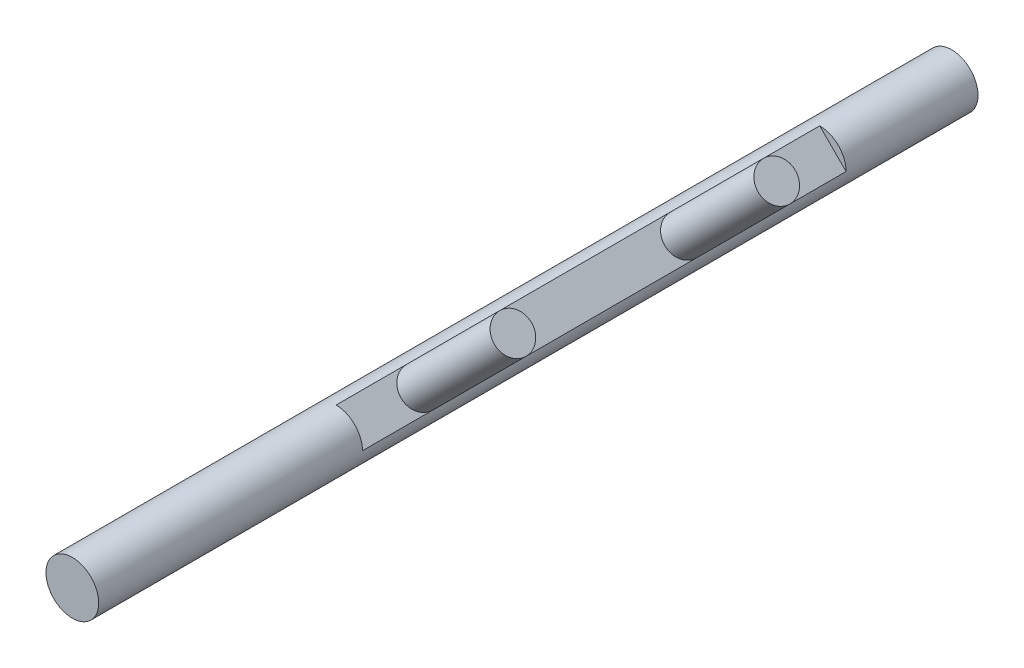
ISO-10303-21;
HEADER;
FILE_DESCRIPTION(('STEP AP214'),'2;1');
FILE_NAME('part.step','',(''),(''),'','','');
FILE_SCHEMA(('AUTOMOTIVE_DESIGN { 1 0 10303 214 1 1 1 1 }'));
ENDSEC;
DATA;
#1=APPLICATION_CONTEXT('core data for automotive mechanical design processes');
#2=APPLICATION_PROTOCOL_DEFINITION('international standard','automotive_design',2000,#1);
#3=PRODUCT_CONTEXT('',#1,'mechanical');
#4=PRODUCT('Part','Part','',(#3));
#5=PRODUCT_RELATED_PRODUCT_CATEGORY('part','',(#4));
#6=PRODUCT_DEFINITION_FORMATION('','',#4);
#7=PRODUCT_DEFINITION_CONTEXT('part definition',#1,'design');
#8=PRODUCT_DEFINITION('design','',#6,#7);
#9=PRODUCT_DEFINITION_SHAPE('','',#8);
#10=(LENGTH_UNIT() NAMED_UNIT(*) SI_UNIT(.MILLI.,.METRE.));
#11=(NAMED_UNIT(*) PLANE_ANGLE_UNIT() SI_UNIT($,.RADIAN.));
#12=(NAMED_UNIT(*) SI_UNIT($,.STERADIAN.) SOLID_ANGLE_UNIT());
#13=UNCERTAINTY_MEASURE_WITH_UNIT(LENGTH_MEASURE(1.E-05),#10,'distance_accuracy_value','');
#14=(GEOMETRIC_REPRESENTATION_CONTEXT(3) GLOBAL_UNCERTAINTY_ASSIGNED_CONTEXT((#13)) GLOBAL_UNIT_ASSIGNED_CONTEXT((#10,
#11,#12)) REPRESENTATION_CONTEXT('',''));
#15=CARTESIAN_POINT('',(0.,0.,0.));
#16=DIRECTION('',(0.,0.,1.));
#17=DIRECTION('',(1.,0.,0.));
#18=AXIS2_PLACEMENT_3D('',#15,#16,#17);
#19=CARTESIAN_POINT('',(0.,3.,70.));
#20=DIRECTION('',(-0.707106781186548,-0.707106781186548,0.));
#21=DIRECTION('',(0.707106781186548,-0.707106781186548,0.));
#22=AXIS2_PLACEMENT_3D('',#19,#20,#21);
#23=PLANE('',#22);
#24=CARTESIAN_POINT('',(1.5,1.5,62.));
#25=DIRECTION('',(0.707106781186548,0.707106781186547,0.));
#26=DIRECTION('',(-0.707106781186547,0.707106781186548,0.));
#27=AXIS2_PLACEMENT_3D('',#24,#25,#26);
#28=CIRCLE('',#27,2.12132034355965);
#29=CARTESIAN_POINT('',(3.,0.,62.));
#30=VERTEX_POINT('',#29);
#31=CARTESIAN_POINT('',(0.,3.,62.));
#32=VERTEX_POINT('',#31);
#33=EDGE_CURVE('E104',#30,#32,#28,.T.);
#34=ORIENTED_EDGE('',*,*,#33,.F.);
#35=DIRECTION('',(0.,0.,-1.));
#36=VECTOR('',#35,1.);
#37=CARTESIAN_POINT('',(3.,0.,70.));
#38=LINE('',#37,#36);
#39=CARTESIAN_POINT('',(3.,0.,32.));
#40=VERTEX_POINT('',#39);
#41=EDGE_CURVE('E131',#30,#40,#38,.T.);
#42=ORIENTED_EDGE('',*,*,#41,.T.);
#43=CARTESIAN_POINT('',(1.5,1.5,32.));
#44=DIRECTION('',(0.707106781186548,0.707106781186547,0.));
#45=DIRECTION('',(-0.707106781186547,0.707106781186548,0.));
#46=AXIS2_PLACEMENT_3D('',#43,#44,#45);
#47=CIRCLE('',#46,2.12132034355964);
#48=CARTESIAN_POINT('',(0.,3.,32.));
#49=VERTEX_POINT('',#48);
#50=EDGE_CURVE('E103',#49,#40,#47,.T.);
#51=ORIENTED_EDGE('',*,*,#50,.F.);
#52=DIRECTION('',(0.,0.,-1.));
#53=VECTOR('',#52,1.);
#54=CARTESIAN_POINT('',(0.,3.,70.));
#55=LINE('',#54,#53);
#56=EDGE_CURVE('E60',#32,#49,#55,.T.);
#57=ORIENTED_EDGE('',*,*,#56,.F.);
#58=EDGE_LOOP('',(#34,#42,#51,#57));
#59=FACE_BOUND('',#58,.T.);
#60=ADVANCED_FACE('F35',(#59),#23,.F.);
#61=EDGE_CURVE('E53',#32,#30,#28,.T.);
#62=ORIENTED_EDGE('',*,*,#61,.F.);
#63=CARTESIAN_POINT('',(0.,3.,70.));
#64=VERTEX_POINT('',#63);
#65=EDGE_CURVE('E76',#64,#32,#55,.T.);
#66=ORIENTED_EDGE('',*,*,#65,.F.);
#67=DIRECTION('',(-0.707106781186548,0.707106781186548,0.));
#68=VECTOR('',#67,1.);
#69=CARTESIAN_POINT('',(0.,3.,70.));
#70=LINE('',#69,#68);
#71=CARTESIAN_POINT('',(3.,0.,70.));
#72=VERTEX_POINT('',#71);
#73=EDGE_CURVE('E39',#72,#64,#70,.T.);
#74=ORIENTED_EDGE('',*,*,#73,.F.);
#75=EDGE_CURVE('E93',#72,#30,#38,.T.);
#76=ORIENTED_EDGE('',*,*,#75,.T.);
#77=EDGE_LOOP('',(#62,#66,#74,#76));
#78=FACE_BOUND('',#77,.T.);
#79=ADVANCED_FACE('F78',(#78),#23,.F.);
#80=CARTESIAN_POINT('',(1.5,1.5,32.));
#81=DIRECTION('',(-0.707106781186548,-0.707106781186548,0.));
#82=DIRECTION('',(0.707106781186548,-0.707106781186548,0.));
#83=AXIS2_PLACEMENT_3D('',#80,#81,#82);
#84=CIRCLE('',#83,2.12132034355964);
#85=EDGE_CURVE('E11',#40,#49,#84,.F.);
#86=ORIENTED_EDGE('',*,*,#85,.F.);
#87=CARTESIAN_POINT('',(3.,0.,15.));
#88=VERTEX_POINT('',#87);
#89=EDGE_CURVE('E82',#40,#88,#38,.T.);
#90=ORIENTED_EDGE('',*,*,#89,.T.);
#91=DIRECTION('',(-0.707106781186548,0.707106781186548,0.));
#92=VECTOR('',#91,1.);
#93=CARTESIAN_POINT('',(0.,3.,15.));
#94=LINE('',#93,#92);
#95=CARTESIAN_POINT('',(0.,3.,15.));
#96=VERTEX_POINT('',#95);
#97=EDGE_CURVE('E89',#88,#96,#94,.T.);
#98=ORIENTED_EDGE('',*,*,#97,.T.);
#99=EDGE_CURVE('E88',#49,#96,#55,.T.);
#100=ORIENTED_EDGE('',*,*,#99,.F.);
#101=EDGE_LOOP('',(#86,#90,#98,#100));
#102=FACE_BOUND('',#101,.T.);
#103=ADVANCED_FACE('F151',(#102),#23,.F.);
#104=CARTESIAN_POINT('',(0.,0.,15.));
#105=DIRECTION('',(0.,0.,-1.));
#106=DIRECTION('',(-1.,0.,0.));
#107=AXIS2_PLACEMENT_3D('',#104,#105,#106);
#108=CYLINDRICAL_SURFACE('',#107,3.);
#109=CARTESIAN_POINT('',(0.,0.,15.));
#110=DIRECTION('',(0.,0.,1.));
#111=DIRECTION('',(1.,0.,0.));
#112=AXIS2_PLACEMENT_3D('',#109,#110,#111);
#113=CIRCLE('',#112,3.);
#114=EDGE_CURVE('E45',#88,#96,#113,.T.);
#115=ORIENTED_EDGE('',*,*,#114,.F.);
#116=ORIENTED_EDGE('',*,*,#89,.F.);
#117=ORIENTED_EDGE('',*,*,#41,.F.);
#118=ORIENTED_EDGE('',*,*,#75,.F.);
#119=CARTESIAN_POINT('',(0.,0.,70.));
#120=DIRECTION('',(0.,0.,1.));
#121=DIRECTION('',(1.,0.,0.));
#122=AXIS2_PLACEMENT_3D('',#119,#120,#121);
#123=CIRCLE('',#122,3.);
#124=EDGE_CURVE('E87',#72,#64,#123,.T.);
#125=ORIENTED_EDGE('',*,*,#124,.T.);
#126=ORIENTED_EDGE('',*,*,#65,.T.);
#127=ORIENTED_EDGE('',*,*,#56,.T.);
#128=ORIENTED_EDGE('',*,*,#99,.T.);
#129=EDGE_LOOP('',(#115,#116,#117,#118,#125,#126,#127,#128));
#130=FACE_BOUND('',#129,.T.);
#131=CARTESIAN_POINT('',(0.,0.,0.));
#132=DIRECTION('',(0.,0.,1.));
#133=DIRECTION('',(1.,0.,0.));
#134=AXIS2_PLACEMENT_3D('',#131,#132,#133);
#135=CIRCLE('',#134,3.);
#136=CARTESIAN_POINT('',(3.,0.,0.));
#137=VERTEX_POINT('',#136);
#138=EDGE_CURVE('E141',#137,#137,#135,.T.);
#139=ORIENTED_EDGE('',*,*,#138,.T.);
#140=EDGE_LOOP('',(#139));
#141=FACE_BOUND('',#140,.T.);
#142=CARTESIAN_POINT('',(0.,0.,100.));
#143=DIRECTION('',(0.,0.,1.));
#144=DIRECTION('',(1.,0.,0.));
#145=AXIS2_PLACEMENT_3D('',#142,#143,#144);
#146=CIRCLE('',#145,3.);
#147=CARTESIAN_POINT('',(3.,0.,100.));
#148=VERTEX_POINT('',#147);
#149=EDGE_CURVE('E94',#148,#148,#146,.T.);
#150=ORIENTED_EDGE('',*,*,#149,.F.);
#151=EDGE_LOOP('',(#150));
#152=FACE_BOUND('',#151,.T.);
#153=ADVANCED_FACE('F37',(#130,#141,#152),#108,.T.);
#154=CARTESIAN_POINT('',(0.,0.,15.));
#155=DIRECTION('',(0.,0.,1.));
#156=DIRECTION('',(1.,0.,0.));
#157=AXIS2_PLACEMENT_3D('',#154,#155,#156);
#158=PLANE('',#157);
#159=ORIENTED_EDGE('',*,*,#97,.F.);
#160=ORIENTED_EDGE('',*,*,#114,.T.);
#161=EDGE_LOOP('',(#159,#160));
#162=FACE_BOUND('',#161,.T.);
#163=ADVANCED_FACE('F147',(#162),#158,.T.);
#164=CARTESIAN_POINT('',(0.,0.,0.));
#165=DIRECTION('',(0.,0.,1.));
#166=DIRECTION('',(1.,0.,0.));
#167=AXIS2_PLACEMENT_3D('',#164,#165,#166);
#168=PLANE('',#167);
#169=CARTESIAN_POINT('',(0.,0.,0.));
#170=DIRECTION('',(0.,0.,-1.));
#171=DIRECTION('',(-1.,0.,0.));
#172=AXIS2_PLACEMENT_3D('',#169,#170,#171);
#173=CIRCLE('',#172,2.5);
#174=CARTESIAN_POINT('',(-2.5,0.,0.));
#175=VERTEX_POINT('',#174);
#176=EDGE_CURVE('E136',#175,#175,#173,.T.);
#177=ORIENTED_EDGE('',*,*,#176,.F.);
#178=EDGE_LOOP('',(#177));
#179=FACE_BOUND('',#178,.T.);
#180=ORIENTED_EDGE('',*,*,#138,.F.);
#181=EDGE_LOOP('',(#180));
#182=FACE_BOUND('',#181,.T.);
#183=ADVANCED_FACE('F184',(#179,#182),#168,.F.);
#184=CARTESIAN_POINT('',(0.,0.,5.));
#185=DIRECTION('',(0.,0.,-1.));
#186=DIRECTION('',(-1.,0.,0.));
#187=AXIS2_PLACEMENT_3D('',#184,#185,#186);
#188=CYLINDRICAL_SURFACE('',#187,2.5);
#189=CARTESIAN_POINT('',(0.,0.,5.));
#190=DIRECTION('',(0.,0.,-1.));
#191=DIRECTION('',(-1.,0.,0.));
#192=AXIS2_PLACEMENT_3D('',#189,#190,#191);
#193=CIRCLE('',#192,2.5);
#194=CARTESIAN_POINT('',(-2.5,0.,5.));
#195=VERTEX_POINT('',#194);
#196=EDGE_CURVE('E115',#195,#195,#193,.T.);
#197=ORIENTED_EDGE('',*,*,#196,.F.);
#198=EDGE_LOOP('',(#197));
#199=FACE_BOUND('',#198,.T.);
#200=ORIENTED_EDGE('',*,*,#176,.T.);
#201=EDGE_LOOP('',(#200));
#202=FACE_BOUND('',#201,.T.);
#203=ADVANCED_FACE('F189',(#199,#202),#188,.F.);
#204=CARTESIAN_POINT('',(0.,0.,5.));
#205=DIRECTION('',(0.,0.,-1.));
#206=DIRECTION('',(-1.,0.,0.));
#207=AXIS2_PLACEMENT_3D('',#204,#205,#206);
#208=PLANE('',#207);
#209=ORIENTED_EDGE('',*,*,#196,.T.);
#210=EDGE_LOOP('',(#209));
#211=FACE_BOUND('',#210,.T.);
#212=ADVANCED_FACE('F193',(#211),#208,.T.);
#213=CARTESIAN_POINT('',(12.1066017177982,12.1066017177982,32.));
#214=DIRECTION('',(-0.707106781186548,-0.707106781186547,0.));
#215=DIRECTION('',(0.707106781186547,-0.707106781186548,0.));
#216=AXIS2_PLACEMENT_3D('',#213,#214,#215);
#217=CYLINDRICAL_SURFACE('',#216,2.12132034355964);
#218=CARTESIAN_POINT('',(12.1066017177982,12.1066017177982,32.));
#219=DIRECTION('',(0.707106781186548,0.707106781186547,0.));
#220=DIRECTION('',(-0.707106781186547,0.707106781186548,0.));
#221=AXIS2_PLACEMENT_3D('',#218,#219,#220);
#222=CIRCLE('',#221,2.12132034355964);
#223=CARTESIAN_POINT('',(10.6066017177982,13.6066017177982,32.));
#224=VERTEX_POINT('',#223);
#225=EDGE_CURVE('E107',#224,#224,#222,.T.);
#226=ORIENTED_EDGE('',*,*,#225,.F.);
#227=EDGE_LOOP('',(#226));
#228=FACE_BOUND('',#227,.T.);
#229=ORIENTED_EDGE('',*,*,#50,.T.);
#230=ORIENTED_EDGE('',*,*,#85,.T.);
#231=EDGE_LOOP('',(#229,#230));
#232=FACE_BOUND('',#231,.T.);
#233=ADVANCED_FACE('F165',(#228,#232),#217,.T.);
#234=CARTESIAN_POINT('',(12.1066017177982,12.1066017177982,32.));
#235=DIRECTION('',(0.707106781186548,0.707106781186547,0.));
#236=DIRECTION('',(-0.707106781186547,0.707106781186548,0.));
#237=AXIS2_PLACEMENT_3D('',#234,#235,#236);
#238=PLANE('',#237);
#239=ORIENTED_EDGE('',*,*,#225,.T.);
#240=EDGE_LOOP('',(#239));
#241=FACE_BOUND('',#240,.T.);
#242=ADVANCED_FACE('F156',(#241),#238,.T.);
#243=CARTESIAN_POINT('',(12.1066017177982,12.1066017177982,62.));
#244=DIRECTION('',(-0.707106781186548,-0.707106781186547,0.));
#245=DIRECTION('',(0.707106781186547,-0.707106781186548,0.));
#246=AXIS2_PLACEMENT_3D('',#243,#244,#245);
#247=CYLINDRICAL_SURFACE('',#246,2.12132034355965);
#248=CARTESIAN_POINT('',(12.1066017177982,12.1066017177982,62.));
#249=DIRECTION('',(0.707106781186548,0.707106781186547,0.));
#250=DIRECTION('',(-0.707106781186547,0.707106781186548,0.));
#251=AXIS2_PLACEMENT_3D('',#248,#249,#250);
#252=CIRCLE('',#251,2.12132034355965);
#253=CARTESIAN_POINT('',(10.6066017177982,13.6066017177982,62.));
#254=VERTEX_POINT('',#253);
#255=EDGE_CURVE('E97',#254,#254,#252,.T.);
#256=ORIENTED_EDGE('',*,*,#255,.F.);
#257=EDGE_LOOP('',(#256));
#258=FACE_BOUND('',#257,.T.);
#259=ORIENTED_EDGE('',*,*,#61,.T.);
#260=ORIENTED_EDGE('',*,*,#33,.T.);
#261=EDGE_LOOP('',(#259,#260));
#262=FACE_BOUND('',#261,.T.);
#263=ADVANCED_FACE('F153',(#258,#262),#247,.T.);
#264=CARTESIAN_POINT('',(12.1066017177982,12.1066017177982,62.));
#265=DIRECTION('',(0.707106781186548,0.707106781186547,0.));
#266=DIRECTION('',(-0.707106781186547,0.707106781186548,0.));
#267=AXIS2_PLACEMENT_3D('',#264,#265,#266);
#268=PLANE('',#267);
#269=ORIENTED_EDGE('',*,*,#255,.T.);
#270=EDGE_LOOP('',(#269));
#271=FACE_BOUND('',#270,.T.);
#272=ADVANCED_FACE('F155',(#271),#268,.T.);
#273=CARTESIAN_POINT('',(0.,0.,70.));
#274=DIRECTION('',(0.,0.,1.));
#275=DIRECTION('',(1.,0.,0.));
#276=AXIS2_PLACEMENT_3D('',#273,#274,#275);
#277=PLANE('',#276);
#278=ORIENTED_EDGE('',*,*,#124,.F.);
#279=ORIENTED_EDGE('',*,*,#73,.T.);
#280=EDGE_LOOP('',(#278,#279));
#281=FACE_BOUND('',#280,.T.);
#282=ADVANCED_FACE('F86',(#281),#277,.F.);
#283=CARTESIAN_POINT('',(0.,0.,100.));
#284=DIRECTION('',(0.,0.,1.));
#285=DIRECTION('',(1.,0.,0.));
#286=AXIS2_PLACEMENT_3D('',#283,#284,#285);
#287=PLANE('',#286);
#288=ORIENTED_EDGE('',*,*,#149,.T.);
#289=EDGE_LOOP('',(#288));
#290=FACE_BOUND('',#289,.T.);
#291=ADVANCED_FACE('F244',(#290),#287,.T.);
#292=CLOSED_SHELL('',(#60,#79,#103,#153,#163,#183,#203,#212,#233,#242,#263,#272,#282,#291));
#293=MANIFOLD_SOLID_BREP('B2',#292);
#294=ADVANCED_BREP_SHAPE_REPRESENTATION('',(#18,#293),#14);
#295=SHAPE_DEFINITION_REPRESENTATION(#9,#294);
ENDSEC;
END-ISO-10303-21;
